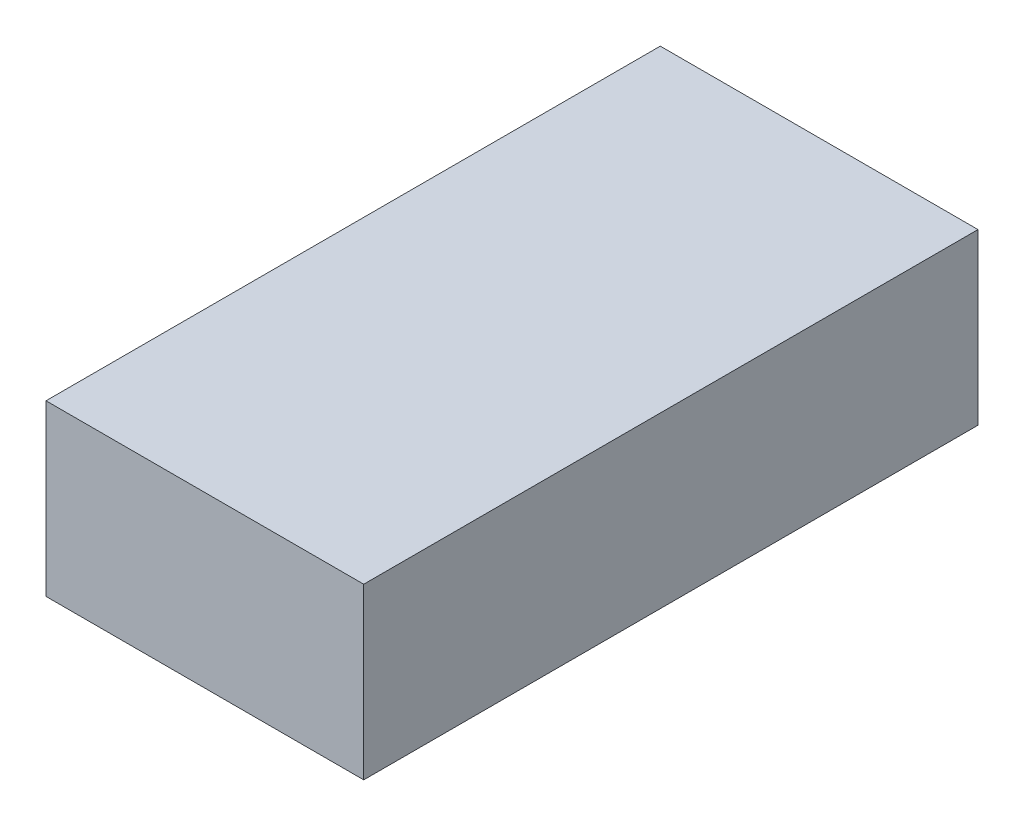
ISO-10303-21;
HEADER;
FILE_DESCRIPTION(('STEP AP214'),'2;1');
FILE_NAME('part.step','',(''),(''),'','','');
FILE_SCHEMA(('AUTOMOTIVE_DESIGN { 1 0 10303 214 1 1 1 1 }'));
ENDSEC;
DATA;
#1=APPLICATION_CONTEXT('core data for automotive mechanical design processes');
#2=APPLICATION_PROTOCOL_DEFINITION('international standard','automotive_design',2000,#1);
#3=PRODUCT_CONTEXT('',#1,'mechanical');
#4=PRODUCT('Part','Part','',(#3));
#5=PRODUCT_RELATED_PRODUCT_CATEGORY('part','',(#4));
#6=PRODUCT_DEFINITION_FORMATION('','',#4);
#7=PRODUCT_DEFINITION_CONTEXT('part definition',#1,'design');
#8=PRODUCT_DEFINITION('design','',#6,#7);
#9=PRODUCT_DEFINITION_SHAPE('','',#8);
#10=(LENGTH_UNIT() NAMED_UNIT(*) SI_UNIT(.MILLI.,.METRE.));
#11=(NAMED_UNIT(*) PLANE_ANGLE_UNIT() SI_UNIT($,.RADIAN.));
#12=(NAMED_UNIT(*) SI_UNIT($,.STERADIAN.) SOLID_ANGLE_UNIT());
#13=UNCERTAINTY_MEASURE_WITH_UNIT(LENGTH_MEASURE(1.E-05),#10,'distance_accuracy_value','');
#14=(GEOMETRIC_REPRESENTATION_CONTEXT(3) GLOBAL_UNCERTAINTY_ASSIGNED_CONTEXT((#13)) GLOBAL_UNIT_ASSIGNED_CONTEXT((#10,
#11,#12)) REPRESENTATION_CONTEXT('',''));
#15=CARTESIAN_POINT('',(0.,0.,0.));
#16=DIRECTION('',(0.,0.,1.));
#17=DIRECTION('',(1.,0.,0.));
#18=AXIS2_PLACEMENT_3D('',#15,#16,#17);
#19=CARTESIAN_POINT('',(0.,4.105,0.));
#20=DIRECTION('',(0.,1.,0.));
#21=DIRECTION('',(1.,0.,0.));
#22=AXIS2_PLACEMENT_3D('',#19,#20,#21);
#23=PLANE('',#22);
#24=DIRECTION('',(0.,0.,1.));
#25=VECTOR('',#24,1.);
#26=CARTESIAN_POINT('',(-2.578,4.105,0.));
#27=LINE('',#26,#25);
#28=CARTESIAN_POINT('',(-2.578,4.105,2.59));
#29=VERTEX_POINT('',#28);
#30=CARTESIAN_POINT('',(-2.578,4.105,5.49));
#31=VERTEX_POINT('',#30);
#32=EDGE_CURVE('E11',#29,#31,#27,.T.);
#33=ORIENTED_EDGE('',*,*,#32,.T.);
#34=DIRECTION('',(1.,0.,0.));
#35=VECTOR('',#34,1.);
#36=CARTESIAN_POINT('',(0.,4.105,5.49));
#37=LINE('',#36,#35);
#38=CARTESIAN_POINT('',(-1.078,4.105,5.49));
#39=VERTEX_POINT('',#38);
#40=EDGE_CURVE('E24',#31,#39,#37,.T.);
#41=ORIENTED_EDGE('',*,*,#40,.T.);
#42=DIRECTION('',(0.,0.,-1.));
#43=VECTOR('',#42,1.);
#44=CARTESIAN_POINT('',(-1.078,4.105,0.));
#45=LINE('',#44,#43);
#46=CARTESIAN_POINT('',(-1.078,4.105,2.59));
#47=VERTEX_POINT('',#46);
#48=EDGE_CURVE('E88',#39,#47,#45,.T.);
#49=ORIENTED_EDGE('',*,*,#48,.T.);
#50=DIRECTION('',(-1.,0.,0.));
#51=VECTOR('',#50,1.);
#52=CARTESIAN_POINT('',(0.,4.105,2.59));
#53=LINE('',#52,#51);
#54=EDGE_CURVE('E59',#47,#29,#53,.T.);
#55=ORIENTED_EDGE('',*,*,#54,.T.);
#56=EDGE_LOOP('',(#33,#41,#49,#55));
#57=FACE_BOUND('',#56,.T.);
#58=ADVANCED_FACE('F17',(#57),#23,.T.);
#59=CARTESIAN_POINT('',(-2.578,4.105,5.49));
#60=DIRECTION('',(0.,0.,-1.));
#61=DIRECTION('',(0.,-1.,0.));
#62=AXIS2_PLACEMENT_3D('',#59,#60,#61);
#63=PLANE('',#62);
#64=DIRECTION('',(0.,-1.,0.));
#65=VECTOR('',#64,1.);
#66=CARTESIAN_POINT('',(-1.078,4.105,5.49));
#67=LINE('',#66,#65);
#68=CARTESIAN_POINT('',(-1.078,3.305,5.49));
#69=VERTEX_POINT('',#68);
#70=EDGE_CURVE('E75',#39,#69,#67,.T.);
#71=ORIENTED_EDGE('',*,*,#70,.F.);
#72=ORIENTED_EDGE('',*,*,#40,.F.);
#73=DIRECTION('',(0.,1.,0.));
#74=VECTOR('',#73,1.);
#75=CARTESIAN_POINT('',(-2.578,4.105,5.49));
#76=LINE('',#75,#74);
#77=CARTESIAN_POINT('',(-2.578,3.305,5.49));
#78=VERTEX_POINT('',#77);
#79=EDGE_CURVE('E84',#78,#31,#76,.T.);
#80=ORIENTED_EDGE('',*,*,#79,.F.);
#81=DIRECTION('',(1.,0.,0.));
#82=VECTOR('',#81,1.);
#83=CARTESIAN_POINT('',(0.,3.305,5.49));
#84=LINE('',#83,#82);
#85=EDGE_CURVE('E82',#78,#69,#84,.T.);
#86=ORIENTED_EDGE('',*,*,#85,.T.);
#87=EDGE_LOOP('',(#71,#72,#80,#86));
#88=FACE_BOUND('',#87,.T.);
#89=ADVANCED_FACE('F90',(#88),#63,.F.);
#90=CARTESIAN_POINT('',(-2.578,4.105,2.59));
#91=DIRECTION('',(1.,0.,0.));
#92=DIRECTION('',(0.,1.,0.));
#93=AXIS2_PLACEMENT_3D('',#90,#91,#92);
#94=PLANE('',#93);
#95=ORIENTED_EDGE('',*,*,#79,.T.);
#96=ORIENTED_EDGE('',*,*,#32,.F.);
#97=DIRECTION('',(0.,1.,0.));
#98=VECTOR('',#97,1.);
#99=CARTESIAN_POINT('',(-2.578,4.105,2.59));
#100=LINE('',#99,#98);
#101=CARTESIAN_POINT('',(-2.578,3.305,2.59));
#102=VERTEX_POINT('',#101);
#103=EDGE_CURVE('E80',#102,#29,#100,.T.);
#104=ORIENTED_EDGE('',*,*,#103,.F.);
#105=DIRECTION('',(0.,0.,-1.));
#106=VECTOR('',#105,1.);
#107=CARTESIAN_POINT('',(-2.578,3.305,2.59));
#108=LINE('',#107,#106);
#109=EDGE_CURVE('E63',#78,#102,#108,.T.);
#110=ORIENTED_EDGE('',*,*,#109,.F.);
#111=EDGE_LOOP('',(#95,#96,#104,#110));
#112=FACE_BOUND('',#111,.T.);
#113=ADVANCED_FACE('F91',(#112),#94,.F.);
#114=CARTESIAN_POINT('',(-1.078,4.105,2.59));
#115=DIRECTION('',(0.,0.,1.));
#116=DIRECTION('',(1.,0.,0.));
#117=AXIS2_PLACEMENT_3D('',#114,#115,#116);
#118=PLANE('',#117);
#119=ORIENTED_EDGE('',*,*,#103,.T.);
#120=ORIENTED_EDGE('',*,*,#54,.F.);
#121=DIRECTION('',(0.,1.,0.));
#122=VECTOR('',#121,1.);
#123=CARTESIAN_POINT('',(-1.078,4.105,2.59));
#124=LINE('',#123,#122);
#125=CARTESIAN_POINT('',(-1.078,3.305,2.59));
#126=VERTEX_POINT('',#125);
#127=EDGE_CURVE('E54',#126,#47,#124,.T.);
#128=ORIENTED_EDGE('',*,*,#127,.F.);
#129=DIRECTION('',(1.,0.,0.));
#130=VECTOR('',#129,1.);
#131=CARTESIAN_POINT('',(-1.078,3.305,2.59));
#132=LINE('',#131,#130);
#133=EDGE_CURVE('E58',#102,#126,#132,.T.);
#134=ORIENTED_EDGE('',*,*,#133,.F.);
#135=EDGE_LOOP('',(#119,#120,#128,#134));
#136=FACE_BOUND('',#135,.T.);
#137=ADVANCED_FACE('F57',(#136),#118,.F.);
#138=CARTESIAN_POINT('',(-1.078,4.105,5.49));
#139=DIRECTION('',(-1.,0.,0.));
#140=DIRECTION('',(0.,0.,1.));
#141=AXIS2_PLACEMENT_3D('',#138,#139,#140);
#142=PLANE('',#141);
#143=ORIENTED_EDGE('',*,*,#127,.T.);
#144=ORIENTED_EDGE('',*,*,#48,.F.);
#145=ORIENTED_EDGE('',*,*,#70,.T.);
#146=DIRECTION('',(0.,0.,1.));
#147=VECTOR('',#146,1.);
#148=CARTESIAN_POINT('',(-1.078,3.305,5.49));
#149=LINE('',#148,#147);
#150=EDGE_CURVE('E70',#126,#69,#149,.T.);
#151=ORIENTED_EDGE('',*,*,#150,.F.);
#152=EDGE_LOOP('',(#143,#144,#145,#151));
#153=FACE_BOUND('',#152,.T.);
#154=ADVANCED_FACE('F73',(#153),#142,.F.);
#155=CARTESIAN_POINT('',(0.,3.305,0.));
#156=DIRECTION('',(0.,1.,0.));
#157=DIRECTION('',(1.,0.,0.));
#158=AXIS2_PLACEMENT_3D('',#155,#156,#157);
#159=PLANE('',#158);
#160=ORIENTED_EDGE('',*,*,#85,.F.);
#161=ORIENTED_EDGE('',*,*,#109,.T.);
#162=ORIENTED_EDGE('',*,*,#133,.T.);
#163=ORIENTED_EDGE('',*,*,#150,.T.);
#164=EDGE_LOOP('',(#160,#161,#162,#163));
#165=FACE_BOUND('',#164,.T.);
#166=ADVANCED_FACE('F69',(#165),#159,.F.);
#167=CLOSED_SHELL('',(#58,#89,#113,#137,#154,#166));
#168=MANIFOLD_SOLID_BREP('B1',#167);
#169=ADVANCED_BREP_SHAPE_REPRESENTATION('',(#18,#168),#14);
#170=SHAPE_DEFINITION_REPRESENTATION(#9,#169);
ENDSEC;
END-ISO-10303-21;
